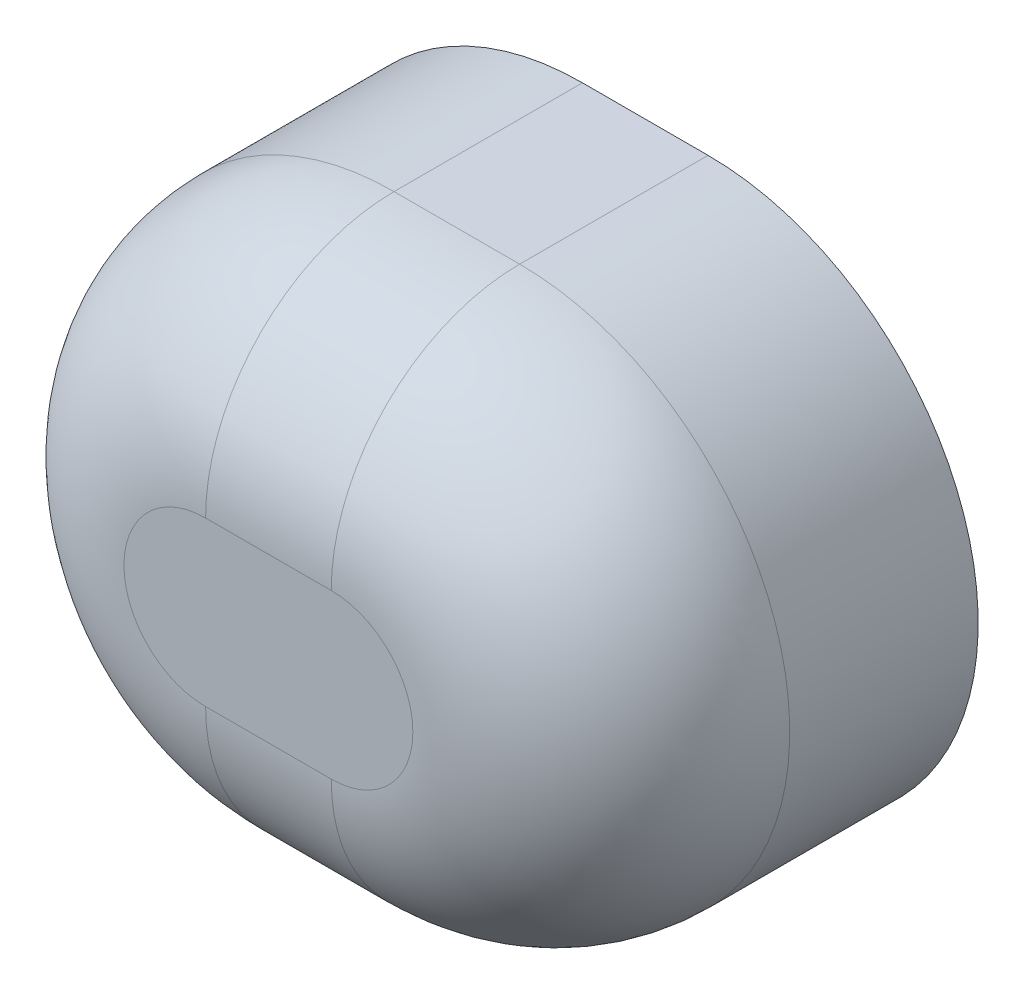
ISO-10303-21;
HEADER;
FILE_DESCRIPTION(('STEP AP214'),'2;1');
FILE_NAME('part.step','',(''),(''),'','','');
FILE_SCHEMA(('AUTOMOTIVE_DESIGN { 1 0 10303 214 1 1 1 1 }'));
ENDSEC;
DATA;
#1=APPLICATION_CONTEXT('core data for automotive mechanical design processes');
#2=APPLICATION_PROTOCOL_DEFINITION('international standard','automotive_design',2000,#1);
#3=PRODUCT_CONTEXT('',#1,'mechanical');
#4=PRODUCT('Part','Part','',(#3));
#5=PRODUCT_RELATED_PRODUCT_CATEGORY('part','',(#4));
#6=PRODUCT_DEFINITION_FORMATION('','',#4);
#7=PRODUCT_DEFINITION_CONTEXT('part definition',#1,'design');
#8=PRODUCT_DEFINITION('design','',#6,#7);
#9=PRODUCT_DEFINITION_SHAPE('','',#8);
#10=(LENGTH_UNIT() NAMED_UNIT(*) SI_UNIT(.MILLI.,.METRE.));
#11=(NAMED_UNIT(*) PLANE_ANGLE_UNIT() SI_UNIT($,.RADIAN.));
#12=(NAMED_UNIT(*) SI_UNIT($,.STERADIAN.) SOLID_ANGLE_UNIT());
#13=UNCERTAINTY_MEASURE_WITH_UNIT(LENGTH_MEASURE(1.E-05),#10,'distance_accuracy_value','');
#14=(GEOMETRIC_REPRESENTATION_CONTEXT(3) GLOBAL_UNCERTAINTY_ASSIGNED_CONTEXT((#13)) GLOBAL_UNIT_ASSIGNED_CONTEXT((#10,
#11,#12)) REPRESENTATION_CONTEXT('',''));
#15=CARTESIAN_POINT('',(0.,0.,0.));
#16=DIRECTION('',(0.,0.,1.));
#17=DIRECTION('',(1.,0.,0.));
#18=AXIS2_PLACEMENT_3D('',#15,#16,#17);
#19=CARTESIAN_POINT('',(-5.24547373997381,0.,3.));
#20=DIRECTION('',(0.,0.,-1.));
#21=DIRECTION('',(-1.,0.,0.));
#22=AXIS2_PLACEMENT_3D('',#19,#20,#21);
#23=CYLINDRICAL_SURFACE('',#22,2.15);
#24=DIRECTION('',(0.,0.,-1.));
#25=VECTOR('',#24,1.);
#26=CARTESIAN_POINT('',(-5.24547373997381,-2.15,3.));
#27=LINE('',#26,#25);
#28=CARTESIAN_POINT('',(-5.24547373997381,-2.15,1.5));
#29=VERTEX_POINT('',#28);
#30=CARTESIAN_POINT('',(-5.24547373997381,-2.15,0.));
#31=VERTEX_POINT('',#30);
#32=EDGE_CURVE('E92',#29,#31,#27,.T.);
#33=ORIENTED_EDGE('',*,*,#32,.F.);
#34=CARTESIAN_POINT('',(-5.24547373997381,0.,1.5));
#35=DIRECTION('',(0.,0.,1.));
#36=DIRECTION('',(1.,0.,0.));
#37=AXIS2_PLACEMENT_3D('',#34,#35,#36);
#38=CIRCLE('',#37,2.15);
#39=CARTESIAN_POINT('',(-5.24547373997381,2.15,1.5));
#40=VERTEX_POINT('',#39);
#41=EDGE_CURVE('E11',#29,#40,#38,.F.);
#42=ORIENTED_EDGE('',*,*,#41,.T.);
#43=DIRECTION('',(0.,0.,-1.));
#44=VECTOR('',#43,1.);
#45=CARTESIAN_POINT('',(-5.24547373997381,2.15,3.));
#46=LINE('',#45,#44);
#47=CARTESIAN_POINT('',(-5.24547373997381,2.15,0.));
#48=VERTEX_POINT('',#47);
#49=EDGE_CURVE('E115',#40,#48,#46,.T.);
#50=ORIENTED_EDGE('',*,*,#49,.T.);
#51=CARTESIAN_POINT('',(-5.24547373997381,0.,0.));
#52=DIRECTION('',(0.,0.,1.));
#53=DIRECTION('',(1.,0.,0.));
#54=AXIS2_PLACEMENT_3D('',#51,#52,#53);
#55=CIRCLE('',#54,2.15);
#56=EDGE_CURVE('E108',#48,#31,#55,.T.);
#57=ORIENTED_EDGE('',*,*,#56,.T.);
#58=EDGE_LOOP('',(#33,#42,#50,#57));
#59=FACE_BOUND('',#58,.T.);
#60=ADVANCED_FACE('F39',(#59),#23,.T.);
#61=CARTESIAN_POINT('',(-5.24547373997381,-2.15,3.));
#62=DIRECTION('',(0.,1.,0.));
#63=DIRECTION('',(0.,0.,1.));
#64=AXIS2_PLACEMENT_3D('',#61,#62,#63);
#65=PLANE('',#64);
#66=DIRECTION('',(0.,0.,-1.));
#67=VECTOR('',#66,1.);
#68=CARTESIAN_POINT('',(-4.2454737399738,-2.15,3.));
#69=LINE('',#68,#67);
#70=CARTESIAN_POINT('',(-4.2454737399738,-2.15,1.5));
#71=VERTEX_POINT('',#70);
#72=CARTESIAN_POINT('',(-4.2454737399738,-2.15,0.));
#73=VERTEX_POINT('',#72);
#74=EDGE_CURVE('E102',#71,#73,#69,.T.);
#75=ORIENTED_EDGE('',*,*,#74,.F.);
#76=DIRECTION('',(1.,0.,0.));
#77=VECTOR('',#76,1.);
#78=CARTESIAN_POINT('',(-5.24547373997381,-2.15,1.5));
#79=LINE('',#78,#77);
#80=EDGE_CURVE('E49',#71,#29,#79,.F.);
#81=ORIENTED_EDGE('',*,*,#80,.T.);
#82=ORIENTED_EDGE('',*,*,#32,.T.);
#83=DIRECTION('',(1.,0.,0.));
#84=VECTOR('',#83,1.);
#85=CARTESIAN_POINT('',(-5.24547373997381,-2.15,0.));
#86=LINE('',#85,#84);
#87=EDGE_CURVE('E95',#31,#73,#86,.T.);
#88=ORIENTED_EDGE('',*,*,#87,.T.);
#89=EDGE_LOOP('',(#75,#81,#82,#88));
#90=FACE_BOUND('',#89,.T.);
#91=ADVANCED_FACE('F94',(#90),#65,.F.);
#92=CARTESIAN_POINT('',(-4.2454737399738,0.,3.));
#93=DIRECTION('',(0.,0.,-1.));
#94=DIRECTION('',(-1.,0.,0.));
#95=AXIS2_PLACEMENT_3D('',#92,#93,#94);
#96=CYLINDRICAL_SURFACE('',#95,2.15);
#97=DIRECTION('',(0.,0.,-1.));
#98=VECTOR('',#97,1.);
#99=CARTESIAN_POINT('',(-4.2454737399738,2.15,3.));
#100=LINE('',#99,#98);
#101=CARTESIAN_POINT('',(-4.2454737399738,2.15,1.5));
#102=VERTEX_POINT('',#101);
#103=CARTESIAN_POINT('',(-4.2454737399738,2.15,0.));
#104=VERTEX_POINT('',#103);
#105=EDGE_CURVE('E129',#102,#104,#100,.T.);
#106=ORIENTED_EDGE('',*,*,#105,.F.);
#107=CARTESIAN_POINT('',(-4.2454737399738,0.,1.5));
#108=DIRECTION('',(0.,0.,1.));
#109=DIRECTION('',(1.,0.,0.));
#110=AXIS2_PLACEMENT_3D('',#107,#108,#109);
#111=CIRCLE('',#110,2.15);
#112=EDGE_CURVE('E64',#102,#71,#111,.F.);
#113=ORIENTED_EDGE('',*,*,#112,.T.);
#114=ORIENTED_EDGE('',*,*,#74,.T.);
#115=CARTESIAN_POINT('',(-4.2454737399738,0.,0.));
#116=DIRECTION('',(0.,0.,1.));
#117=DIRECTION('',(1.,0.,0.));
#118=AXIS2_PLACEMENT_3D('',#115,#116,#117);
#119=CIRCLE('',#118,2.15);
#120=EDGE_CURVE('E111',#73,#104,#119,.T.);
#121=ORIENTED_EDGE('',*,*,#120,.T.);
#122=EDGE_LOOP('',(#106,#113,#114,#121));
#123=FACE_BOUND('',#122,.T.);
#124=ADVANCED_FACE('F176',(#123),#96,.T.);
#125=CARTESIAN_POINT('',(-5.24547373997381,2.15,3.));
#126=DIRECTION('',(0.,1.,0.));
#127=DIRECTION('',(0.,0.,1.));
#128=AXIS2_PLACEMENT_3D('',#125,#126,#127);
#129=PLANE('',#128);
#130=ORIENTED_EDGE('',*,*,#49,.F.);
#131=DIRECTION('',(1.,0.,0.));
#132=VECTOR('',#131,1.);
#133=CARTESIAN_POINT('',(-5.24547373997381,2.15,1.5));
#134=LINE('',#133,#132);
#135=EDGE_CURVE('E101',#40,#102,#134,.T.);
#136=ORIENTED_EDGE('',*,*,#135,.T.);
#137=ORIENTED_EDGE('',*,*,#105,.T.);
#138=DIRECTION('',(1.,0.,0.));
#139=VECTOR('',#138,1.);
#140=CARTESIAN_POINT('',(-5.24547373997381,2.15,0.));
#141=LINE('',#140,#139);
#142=EDGE_CURVE('E124',#48,#104,#141,.T.);
#143=ORIENTED_EDGE('',*,*,#142,.F.);
#144=EDGE_LOOP('',(#130,#136,#137,#143));
#145=FACE_BOUND('',#144,.T.);
#146=ADVANCED_FACE('F175',(#145),#129,.T.);
#147=CARTESIAN_POINT('',(-5.24547373997381,0.,3.));
#148=DIRECTION('',(0.,0.,1.));
#149=DIRECTION('',(1.,0.,0.));
#150=AXIS2_PLACEMENT_3D('',#147,#148,#149);
#151=PLANE('',#150);
#152=CARTESIAN_POINT('',(-4.2454737399738,0.,3.));
#153=DIRECTION('',(0.,0.,1.));
#154=DIRECTION('',(1.,0.,0.));
#155=AXIS2_PLACEMENT_3D('',#152,#153,#154);
#156=CIRCLE('',#155,0.65);
#157=CARTESIAN_POINT('',(-4.2454737399738,-0.65,3.));
#158=VERTEX_POINT('',#157);
#159=CARTESIAN_POINT('',(-4.2454737399738,0.65,3.));
#160=VERTEX_POINT('',#159);
#161=EDGE_CURVE('E143',#158,#160,#156,.T.);
#162=ORIENTED_EDGE('',*,*,#161,.T.);
#163=DIRECTION('',(1.,0.,0.));
#164=VECTOR('',#163,1.);
#165=CARTESIAN_POINT('',(-5.24547373997381,0.65,3.));
#166=LINE('',#165,#164);
#167=CARTESIAN_POINT('',(-5.24547373997381,0.65,3.));
#168=VERTEX_POINT('',#167);
#169=EDGE_CURVE('E146',#160,#168,#166,.F.);
#170=ORIENTED_EDGE('',*,*,#169,.T.);
#171=CARTESIAN_POINT('',(-5.24547373997381,0.,3.));
#172=DIRECTION('',(0.,0.,1.));
#173=DIRECTION('',(1.,0.,0.));
#174=AXIS2_PLACEMENT_3D('',#171,#172,#173);
#175=CIRCLE('',#174,0.65);
#176=CARTESIAN_POINT('',(-5.24547373997381,-0.65,3.));
#177=VERTEX_POINT('',#176);
#178=EDGE_CURVE('E137',#168,#177,#175,.T.);
#179=ORIENTED_EDGE('',*,*,#178,.T.);
#180=DIRECTION('',(1.,0.,0.));
#181=VECTOR('',#180,1.);
#182=CARTESIAN_POINT('',(-4.2454737399738,-0.65,3.));
#183=LINE('',#182,#181);
#184=EDGE_CURVE('E140',#177,#158,#183,.T.);
#185=ORIENTED_EDGE('',*,*,#184,.T.);
#186=EDGE_LOOP('',(#162,#170,#179,#185));
#187=FACE_BOUND('',#186,.T.);
#188=ADVANCED_FACE('F183',(#187),#151,.T.);
#189=CARTESIAN_POINT('',(-5.24547373997381,0.,0.));
#190=DIRECTION('',(0.,0.,1.));
#191=DIRECTION('',(1.,0.,0.));
#192=AXIS2_PLACEMENT_3D('',#189,#190,#191);
#193=PLANE('',#192);
#194=ORIENTED_EDGE('',*,*,#56,.F.);
#195=ORIENTED_EDGE('',*,*,#142,.T.);
#196=ORIENTED_EDGE('',*,*,#120,.F.);
#197=ORIENTED_EDGE('',*,*,#87,.F.);
#198=EDGE_LOOP('',(#194,#195,#196,#197));
#199=FACE_BOUND('',#198,.T.);
#200=ADVANCED_FACE('F106',(#199),#193,.F.);
#201=CARTESIAN_POINT('',(-5.24547373997381,-0.65,1.5));
#202=DIRECTION('',(-1.,0.,0.));
#203=DIRECTION('',(0.,0.,1.));
#204=AXIS2_PLACEMENT_3D('',#201,#202,#203);
#205=CYLINDRICAL_SURFACE('',#204,1.5);
#206=CARTESIAN_POINT('',(-4.2454737399738,-0.65,1.5));
#207=DIRECTION('',(1.,0.,0.));
#208=DIRECTION('',(0.,0.,-1.));
#209=AXIS2_PLACEMENT_3D('',#206,#207,#208);
#210=CIRCLE('',#209,1.5);
#211=EDGE_CURVE('E120',#158,#71,#210,.T.);
#212=ORIENTED_EDGE('',*,*,#211,.F.);
#213=ORIENTED_EDGE('',*,*,#184,.F.);
#214=CARTESIAN_POINT('',(-5.24547373997381,-0.65,1.5));
#215=DIRECTION('',(-1.,0.,0.));
#216=DIRECTION('',(0.,0.,1.));
#217=AXIS2_PLACEMENT_3D('',#214,#215,#216);
#218=CIRCLE('',#217,1.5);
#219=EDGE_CURVE('E43',#29,#177,#218,.T.);
#220=ORIENTED_EDGE('',*,*,#219,.F.);
#221=ORIENTED_EDGE('',*,*,#80,.F.);
#222=EDGE_LOOP('',(#212,#213,#220,#221));
#223=FACE_BOUND('',#222,.T.);
#224=ADVANCED_FACE('F41',(#223),#205,.T.);
#225=CARTESIAN_POINT('',(-5.24547373997381,0.,1.5));
#226=DIRECTION('',(0.,0.,1.));
#227=DIRECTION('',(1.,0.,0.));
#228=AXIS2_PLACEMENT_3D('',#225,#226,#227);
#229=DEGENERATE_TOROIDAL_SURFACE('',#228,0.65,1.5,.T.);
#230=ORIENTED_EDGE('',*,*,#219,.T.);
#231=ORIENTED_EDGE('',*,*,#178,.F.);
#232=CARTESIAN_POINT('',(-5.24547373997381,0.65,1.5));
#233=DIRECTION('',(1.,0.,0.));
#234=DIRECTION('',(0.,0.,-1.));
#235=AXIS2_PLACEMENT_3D('',#232,#233,#234);
#236=CIRCLE('',#235,1.5);
#237=EDGE_CURVE('E157',#40,#168,#236,.T.);
#238=ORIENTED_EDGE('',*,*,#237,.F.);
#239=ORIENTED_EDGE('',*,*,#41,.F.);
#240=EDGE_LOOP('',(#230,#231,#238,#239));
#241=FACE_BOUND('',#240,.T.);
#242=ADVANCED_FACE('F172',(#241),#229,.T.);
#243=CARTESIAN_POINT('',(-4.2454737399738,0.,1.5));
#244=DIRECTION('',(0.,0.,1.));
#245=DIRECTION('',(1.,0.,0.));
#246=AXIS2_PLACEMENT_3D('',#243,#244,#245);
#247=DEGENERATE_TOROIDAL_SURFACE('',#246,0.65,1.5,.T.);
#248=ORIENTED_EDGE('',*,*,#211,.T.);
#249=ORIENTED_EDGE('',*,*,#112,.F.);
#250=CARTESIAN_POINT('',(-4.2454737399738,0.65,1.5));
#251=DIRECTION('',(-1.,0.,0.));
#252=DIRECTION('',(0.,0.,1.));
#253=AXIS2_PLACEMENT_3D('',#250,#251,#252);
#254=CIRCLE('',#253,1.5);
#255=EDGE_CURVE('E154',#160,#102,#254,.T.);
#256=ORIENTED_EDGE('',*,*,#255,.F.);
#257=ORIENTED_EDGE('',*,*,#161,.F.);
#258=EDGE_LOOP('',(#248,#249,#256,#257));
#259=FACE_BOUND('',#258,.T.);
#260=ADVANCED_FACE('F164',(#259),#247,.T.);
#261=CARTESIAN_POINT('',(-5.24547373997381,0.65,1.5));
#262=DIRECTION('',(1.,0.,0.));
#263=DIRECTION('',(0.,0.,-1.));
#264=AXIS2_PLACEMENT_3D('',#261,#262,#263);
#265=CYLINDRICAL_SURFACE('',#264,1.5);
#266=ORIENTED_EDGE('',*,*,#237,.T.);
#267=ORIENTED_EDGE('',*,*,#169,.F.);
#268=ORIENTED_EDGE('',*,*,#255,.T.);
#269=ORIENTED_EDGE('',*,*,#135,.F.);
#270=EDGE_LOOP('',(#266,#267,#268,#269));
#271=FACE_BOUND('',#270,.T.);
#272=ADVANCED_FACE('F191',(#271),#265,.T.);
#273=CLOSED_SHELL('',(#60,#91,#124,#146,#188,#200,#224,#242,#260,#272));
#274=MANIFOLD_SOLID_BREP('B2',#273);
#275=ADVANCED_BREP_SHAPE_REPRESENTATION('',(#18,#274),#14);
#276=SHAPE_DEFINITION_REPRESENTATION(#9,#275);
ENDSEC;
END-ISO-10303-21;
